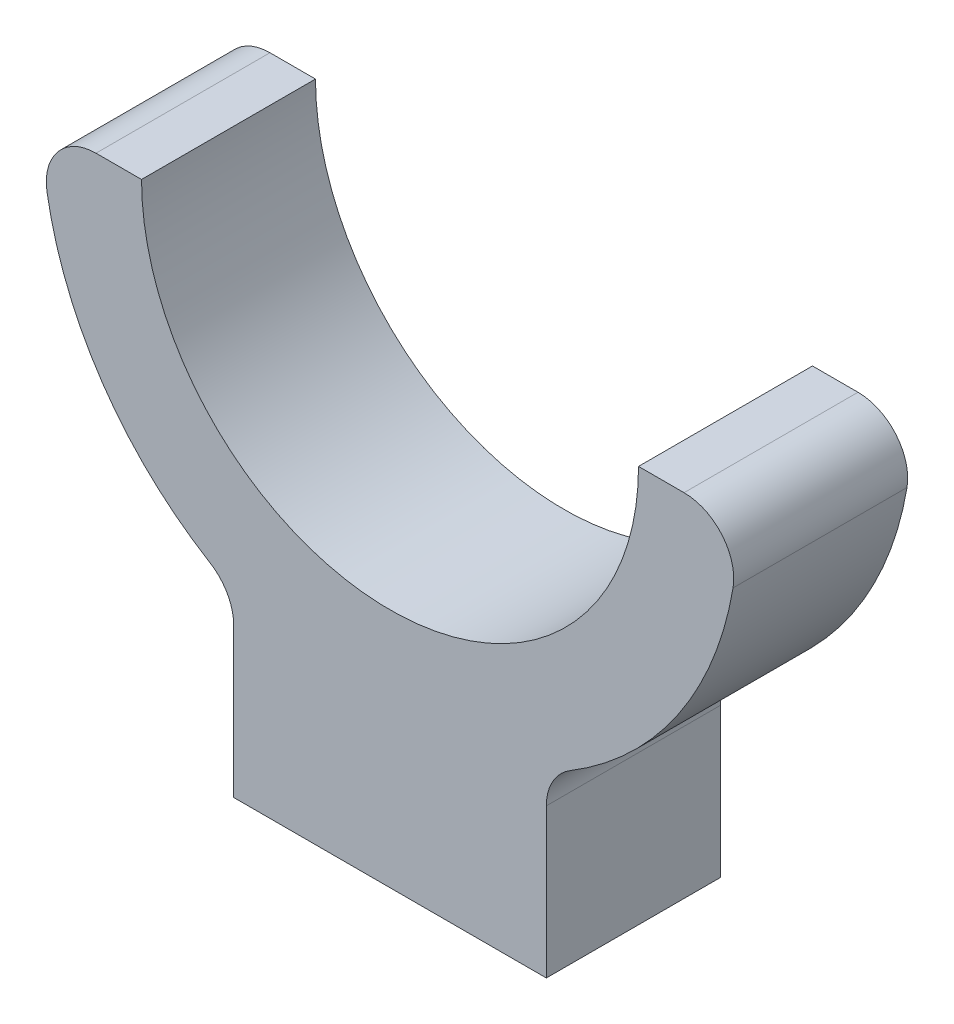
ISO-10303-21;
HEADER;
FILE_DESCRIPTION(('STEP AP214'),'2;1');
FILE_NAME('part.step','',(''),(''),'','','');
FILE_SCHEMA(('AUTOMOTIVE_DESIGN { 1 0 10303 214 1 1 1 1 }'));
ENDSEC;
DATA;
#1=APPLICATION_CONTEXT('core data for automotive mechanical design processes');
#2=APPLICATION_PROTOCOL_DEFINITION('international standard','automotive_design',2000,#1);
#3=PRODUCT_CONTEXT('',#1,'mechanical');
#4=PRODUCT('Part','Part','',(#3));
#5=PRODUCT_RELATED_PRODUCT_CATEGORY('part','',(#4));
#6=PRODUCT_DEFINITION_FORMATION('','',#4);
#7=PRODUCT_DEFINITION_CONTEXT('part definition',#1,'design');
#8=PRODUCT_DEFINITION('design','',#6,#7);
#9=PRODUCT_DEFINITION_SHAPE('','',#8);
#10=(LENGTH_UNIT() NAMED_UNIT(*) SI_UNIT(.MILLI.,.METRE.));
#11=(NAMED_UNIT(*) PLANE_ANGLE_UNIT() SI_UNIT($,.RADIAN.));
#12=(NAMED_UNIT(*) SI_UNIT($,.STERADIAN.) SOLID_ANGLE_UNIT());
#13=UNCERTAINTY_MEASURE_WITH_UNIT(LENGTH_MEASURE(1.E-05),#10,'distance_accuracy_value','');
#14=(GEOMETRIC_REPRESENTATION_CONTEXT(3) GLOBAL_UNCERTAINTY_ASSIGNED_CONTEXT((#13)) GLOBAL_UNIT_ASSIGNED_CONTEXT((#10,
#11,#12)) REPRESENTATION_CONTEXT('',''));
#15=CARTESIAN_POINT('',(0.,0.,0.));
#16=DIRECTION('',(0.,0.,1.));
#17=DIRECTION('',(1.,0.,0.));
#18=AXIS2_PLACEMENT_3D('',#15,#16,#17);
#19=CARTESIAN_POINT('',(-15.026842649073,-2.54,8.89));
#20=DIRECTION('',(0.,0.,-1.));
#21=DIRECTION('',(-1.,0.,0.));
#22=AXIS2_PLACEMENT_3D('',#19,#20,#21);
#23=CYLINDRICAL_SURFACE('',#22,2.54);
#24=CARTESIAN_POINT('',(-15.026842649073,-2.54,0.));
#25=DIRECTION('',(0.,0.,1.));
#26=DIRECTION('',(-1.,0.,0.));
#27=AXIS2_PLACEMENT_3D('',#24,#25,#26);
#28=CIRCLE('',#27,2.54);
#29=CARTESIAN_POINT('',(-15.026842649073,0.,0.));
#30=VERTEX_POINT('',#29);
#31=CARTESIAN_POINT('',(-17.5313164239185,-2.96333333333333,0.));
#32=VERTEX_POINT('',#31);
#33=EDGE_CURVE('E153',#30,#32,#28,.T.);
#34=ORIENTED_EDGE('',*,*,#33,.T.);
#35=DIRECTION('',(0.,0.,-1.));
#36=VECTOR('',#35,1.);
#37=CARTESIAN_POINT('',(-17.5313164239185,-2.96333333333333,8.89));
#38=LINE('',#37,#36);
#39=CARTESIAN_POINT('',(-17.5313164239185,-2.96333333333333,8.89));
#40=VERTEX_POINT('',#39);
#41=EDGE_CURVE('E11',#40,#32,#38,.T.);
#42=ORIENTED_EDGE('',*,*,#41,.F.);
#43=CARTESIAN_POINT('',(-15.026842649073,-2.54,8.89));
#44=DIRECTION('',(0.,0.,1.));
#45=DIRECTION('',(-1.,0.,0.));
#46=AXIS2_PLACEMENT_3D('',#43,#44,#45);
#47=CIRCLE('',#46,2.54);
#48=CARTESIAN_POINT('',(-15.026842649073,0.,8.89));
#49=VERTEX_POINT('',#48);
#50=EDGE_CURVE('E175',#49,#40,#47,.T.);
#51=ORIENTED_EDGE('',*,*,#50,.F.);
#52=DIRECTION('',(0.,0.,-1.));
#53=VECTOR('',#52,1.);
#54=CARTESIAN_POINT('',(-15.026842649073,0.,8.89));
#55=LINE('',#54,#53);
#56=EDGE_CURVE('E149',#49,#30,#55,.T.);
#57=ORIENTED_EDGE('',*,*,#56,.T.);
#58=EDGE_LOOP('',(#34,#42,#51,#57));
#59=FACE_BOUND('',#58,.T.);
#60=ADVANCED_FACE('F33',(#59),#23,.T.);
#61=CARTESIAN_POINT('',(0.,0.,8.89));
#62=DIRECTION('',(0.,0.,-1.));
#63=DIRECTION('',(-1.,0.,0.));
#64=AXIS2_PLACEMENT_3D('',#61,#62,#63);
#65=CYLINDRICAL_SURFACE('',#64,17.78);
#66=CARTESIAN_POINT('',(0.,0.,0.));
#67=DIRECTION('',(0.,0.,1.));
#68=DIRECTION('',(1.,0.,0.));
#69=AXIS2_PLACEMENT_3D('',#66,#67,#68);
#70=CIRCLE('',#69,17.78);
#71=CARTESIAN_POINT('',(-9.21306073920718,-15.206837666513,0.));
#72=VERTEX_POINT('',#71);
#73=EDGE_CURVE('E156',#32,#72,#70,.T.);
#74=ORIENTED_EDGE('',*,*,#73,.T.);
#75=DIRECTION('',(0.,0.,-1.));
#76=VECTOR('',#75,1.);
#77=CARTESIAN_POINT('',(-9.21306073920718,-15.206837666513,8.89));
#78=LINE('',#77,#76);
#79=CARTESIAN_POINT('',(-9.21306073920718,-15.206837666513,8.89));
#80=VERTEX_POINT('',#79);
#81=EDGE_CURVE('E41',#80,#72,#78,.T.);
#82=ORIENTED_EDGE('',*,*,#81,.F.);
#83=CARTESIAN_POINT('',(0.,0.,8.89));
#84=DIRECTION('',(0.,0.,1.));
#85=DIRECTION('',(1.,0.,0.));
#86=AXIS2_PLACEMENT_3D('',#83,#84,#85);
#87=CIRCLE('',#86,17.78);
#88=EDGE_CURVE('E104',#40,#80,#87,.T.);
#89=ORIENTED_EDGE('',*,*,#88,.F.);
#90=ORIENTED_EDGE('',*,*,#41,.T.);
#91=EDGE_LOOP('',(#74,#82,#89,#90));
#92=FACE_BOUND('',#91,.T.);
#93=ADVANCED_FACE('F253',(#92),#65,.T.);
#94=CARTESIAN_POINT('',(-10.5292122733796,-17.3792430474435,8.89));
#95=DIRECTION('',(0.,0.,-1.));
#96=DIRECTION('',(-1.,0.,0.));
#97=AXIS2_PLACEMENT_3D('',#94,#95,#96);
#98=CYLINDRICAL_SURFACE('',#97,2.54);
#99=CARTESIAN_POINT('',(-10.5292122733796,-17.3792430474435,0.));
#100=DIRECTION('',(0.,0.,-1.));
#101=DIRECTION('',(1.,0.,0.));
#102=AXIS2_PLACEMENT_3D('',#99,#100,#101);
#103=CIRCLE('',#102,2.54);
#104=CARTESIAN_POINT('',(-7.98921227337963,-17.3792430474435,0.));
#105=VERTEX_POINT('',#104);
#106=EDGE_CURVE('E158',#72,#105,#103,.T.);
#107=ORIENTED_EDGE('',*,*,#106,.T.);
#108=DIRECTION('',(0.,0.,-1.));
#109=VECTOR('',#108,1.);
#110=CARTESIAN_POINT('',(-7.98921227337963,-17.3792430474435,8.89));
#111=LINE('',#110,#109);
#112=CARTESIAN_POINT('',(-7.98921227337963,-17.3792430474435,8.89));
#113=VERTEX_POINT('',#112);
#114=EDGE_CURVE('E194',#113,#105,#111,.T.);
#115=ORIENTED_EDGE('',*,*,#114,.F.);
#116=CARTESIAN_POINT('',(-10.5292122733796,-17.3792430474435,8.89));
#117=DIRECTION('',(0.,0.,-1.));
#118=DIRECTION('',(1.,0.,0.));
#119=AXIS2_PLACEMENT_3D('',#116,#117,#118);
#120=CIRCLE('',#119,2.54);
#121=EDGE_CURVE('E202',#80,#113,#120,.T.);
#122=ORIENTED_EDGE('',*,*,#121,.F.);
#123=ORIENTED_EDGE('',*,*,#81,.T.);
#124=EDGE_LOOP('',(#107,#115,#122,#123));
#125=FACE_BOUND('',#124,.T.);
#126=ADVANCED_FACE('F200',(#125),#98,.F.);
#127=CARTESIAN_POINT('',(-7.98921227337963,-17.3792430474435,8.89));
#128=DIRECTION('',(1.,0.,0.));
#129=DIRECTION('',(0.,1.,0.));
#130=AXIS2_PLACEMENT_3D('',#127,#128,#129);
#131=PLANE('',#130);
#132=DIRECTION('',(0.,-1.,0.));
#133=VECTOR('',#132,1.);
#134=CARTESIAN_POINT('',(-7.98921227337963,-17.3792430474435,0.));
#135=LINE('',#134,#133);
#136=CARTESIAN_POINT('',(-7.98921227337962,-24.9992430474435,0.));
#137=VERTEX_POINT('',#136);
#138=EDGE_CURVE('E160',#105,#137,#135,.T.);
#139=ORIENTED_EDGE('',*,*,#138,.T.);
#140=DIRECTION('',(0.,0.,-1.));
#141=VECTOR('',#140,1.);
#142=CARTESIAN_POINT('',(-7.98921227337962,-24.9992430474435,8.89));
#143=LINE('',#142,#141);
#144=CARTESIAN_POINT('',(-7.98921227337962,-24.9992430474435,8.89));
#145=VERTEX_POINT('',#144);
#146=EDGE_CURVE('E191',#145,#137,#143,.T.);
#147=ORIENTED_EDGE('',*,*,#146,.F.);
#148=DIRECTION('',(0.,-1.,0.));
#149=VECTOR('',#148,1.);
#150=CARTESIAN_POINT('',(-7.98921227337963,-17.3792430474435,8.89));
#151=LINE('',#150,#149);
#152=EDGE_CURVE('E220',#113,#145,#151,.T.);
#153=ORIENTED_EDGE('',*,*,#152,.F.);
#154=ORIENTED_EDGE('',*,*,#114,.T.);
#155=EDGE_LOOP('',(#139,#147,#153,#154));
#156=FACE_BOUND('',#155,.T.);
#157=ADVANCED_FACE('F211',(#156),#131,.F.);
#158=CARTESIAN_POINT('',(-7.98921227337962,-24.9992430474435,8.89));
#159=DIRECTION('',(0.,1.,0.));
#160=DIRECTION('',(0.,0.,1.));
#161=AXIS2_PLACEMENT_3D('',#158,#159,#160);
#162=PLANE('',#161);
#163=DIRECTION('',(1.,0.,0.));
#164=VECTOR('',#163,1.);
#165=CARTESIAN_POINT('',(-7.98921227337962,-24.9992430474435,0.));
#166=LINE('',#165,#164);
#167=CARTESIAN_POINT('',(7.98921227337962,-24.9992430474435,0.));
#168=VERTEX_POINT('',#167);
#169=EDGE_CURVE('E162',#137,#168,#166,.T.);
#170=ORIENTED_EDGE('',*,*,#169,.T.);
#171=DIRECTION('',(0.,0.,-1.));
#172=VECTOR('',#171,1.);
#173=CARTESIAN_POINT('',(7.98921227337962,-24.9992430474435,8.89));
#174=LINE('',#173,#172);
#175=CARTESIAN_POINT('',(7.98921227337962,-24.9992430474435,8.89));
#176=VERTEX_POINT('',#175);
#177=EDGE_CURVE('E188',#176,#168,#174,.T.);
#178=ORIENTED_EDGE('',*,*,#177,.F.);
#179=DIRECTION('',(1.,0.,0.));
#180=VECTOR('',#179,1.);
#181=CARTESIAN_POINT('',(-7.98921227337962,-24.9992430474435,8.89));
#182=LINE('',#181,#180);
#183=EDGE_CURVE('E217',#145,#176,#182,.T.);
#184=ORIENTED_EDGE('',*,*,#183,.F.);
#185=ORIENTED_EDGE('',*,*,#146,.T.);
#186=EDGE_LOOP('',(#170,#178,#184,#185));
#187=FACE_BOUND('',#186,.T.);
#188=ADVANCED_FACE('F215',(#187),#162,.F.);
#189=CARTESIAN_POINT('',(7.98921227337962,-17.3792430474435,8.89));
#190=DIRECTION('',(-1.,0.,0.));
#191=DIRECTION('',(0.,0.,1.));
#192=AXIS2_PLACEMENT_3D('',#189,#190,#191);
#193=PLANE('',#192);
#194=DIRECTION('',(0.,1.,0.));
#195=VECTOR('',#194,1.);
#196=CARTESIAN_POINT('',(7.98921227337962,-17.3792430474435,0.));
#197=LINE('',#196,#195);
#198=CARTESIAN_POINT('',(7.98921227337962,-17.3792430474435,0.));
#199=VERTEX_POINT('',#198);
#200=EDGE_CURVE('E164',#168,#199,#197,.T.);
#201=ORIENTED_EDGE('',*,*,#200,.T.);
#202=DIRECTION('',(0.,0.,-1.));
#203=VECTOR('',#202,1.);
#204=CARTESIAN_POINT('',(7.98921227337962,-17.3792430474435,8.89));
#205=LINE('',#204,#203);
#206=CARTESIAN_POINT('',(7.98921227337962,-17.3792430474435,8.89));
#207=VERTEX_POINT('',#206);
#208=EDGE_CURVE('E185',#207,#199,#205,.T.);
#209=ORIENTED_EDGE('',*,*,#208,.F.);
#210=DIRECTION('',(0.,1.,0.));
#211=VECTOR('',#210,1.);
#212=CARTESIAN_POINT('',(7.98921227337962,-17.3792430474435,8.89));
#213=LINE('',#212,#211);
#214=EDGE_CURVE('E219',#176,#207,#213,.T.);
#215=ORIENTED_EDGE('',*,*,#214,.F.);
#216=ORIENTED_EDGE('',*,*,#177,.T.);
#217=EDGE_LOOP('',(#201,#209,#215,#216));
#218=FACE_BOUND('',#217,.T.);
#219=ADVANCED_FACE('F266',(#218),#193,.F.);
#220=CARTESIAN_POINT('',(10.5292122733796,-17.3792430474435,8.89));
#221=DIRECTION('',(0.,0.,-1.));
#222=DIRECTION('',(-1.,0.,0.));
#223=AXIS2_PLACEMENT_3D('',#220,#221,#222);
#224=CYLINDRICAL_SURFACE('',#223,2.54);
#225=CARTESIAN_POINT('',(10.5292122733796,-17.3792430474435,0.));
#226=DIRECTION('',(0.,0.,-1.));
#227=DIRECTION('',(-1.,0.,0.));
#228=AXIS2_PLACEMENT_3D('',#225,#226,#227);
#229=CIRCLE('',#228,2.54);
#230=CARTESIAN_POINT('',(9.21306073920717,-15.206837666513,0.));
#231=VERTEX_POINT('',#230);
#232=EDGE_CURVE('E166',#199,#231,#229,.T.);
#233=ORIENTED_EDGE('',*,*,#232,.T.);
#234=DIRECTION('',(0.,0.,-1.));
#235=VECTOR('',#234,1.);
#236=CARTESIAN_POINT('',(9.21306073920717,-15.206837666513,8.89));
#237=LINE('',#236,#235);
#238=CARTESIAN_POINT('',(9.21306073920717,-15.206837666513,8.89));
#239=VERTEX_POINT('',#238);
#240=EDGE_CURVE('E182',#239,#231,#237,.T.);
#241=ORIENTED_EDGE('',*,*,#240,.F.);
#242=CARTESIAN_POINT('',(10.5292122733796,-17.3792430474435,8.89));
#243=DIRECTION('',(0.,0.,-1.));
#244=DIRECTION('',(-1.,0.,0.));
#245=AXIS2_PLACEMENT_3D('',#242,#243,#244);
#246=CIRCLE('',#245,2.54);
#247=EDGE_CURVE('E222',#207,#239,#246,.T.);
#248=ORIENTED_EDGE('',*,*,#247,.F.);
#249=ORIENTED_EDGE('',*,*,#208,.T.);
#250=EDGE_LOOP('',(#233,#241,#248,#249));
#251=FACE_BOUND('',#250,.T.);
#252=ADVANCED_FACE('F269',(#251),#224,.F.);
#253=CARTESIAN_POINT('',(0.,0.,8.89));
#254=DIRECTION('',(0.,0.,-1.));
#255=DIRECTION('',(-1.,0.,0.));
#256=AXIS2_PLACEMENT_3D('',#253,#254,#255);
#257=CYLINDRICAL_SURFACE('',#256,17.78);
#258=CARTESIAN_POINT('',(0.,0.,0.));
#259=DIRECTION('',(0.,0.,1.));
#260=DIRECTION('',(1.,0.,0.));
#261=AXIS2_PLACEMENT_3D('',#258,#259,#260);
#262=CIRCLE('',#261,17.78);
#263=CARTESIAN_POINT('',(17.5313164239185,-2.96333333333334,0.));
#264=VERTEX_POINT('',#263);
#265=EDGE_CURVE('E168',#231,#264,#262,.T.);
#266=ORIENTED_EDGE('',*,*,#265,.T.);
#267=DIRECTION('',(0.,0.,-1.));
#268=VECTOR('',#267,1.);
#269=CARTESIAN_POINT('',(17.5313164239185,-2.96333333333334,8.89));
#270=LINE('',#269,#268);
#271=CARTESIAN_POINT('',(17.5313164239185,-2.96333333333334,8.89));
#272=VERTEX_POINT('',#271);
#273=EDGE_CURVE('E179',#272,#264,#270,.T.);
#274=ORIENTED_EDGE('',*,*,#273,.F.);
#275=CARTESIAN_POINT('',(0.,0.,8.89));
#276=DIRECTION('',(0.,0.,1.));
#277=DIRECTION('',(1.,0.,0.));
#278=AXIS2_PLACEMENT_3D('',#275,#276,#277);
#279=CIRCLE('',#278,17.78);
#280=EDGE_CURVE('E228',#239,#272,#279,.T.);
#281=ORIENTED_EDGE('',*,*,#280,.F.);
#282=ORIENTED_EDGE('',*,*,#240,.T.);
#283=EDGE_LOOP('',(#266,#274,#281,#282));
#284=FACE_BOUND('',#283,.T.);
#285=ADVANCED_FACE('F234',(#284),#257,.T.);
#286=CARTESIAN_POINT('',(15.026842649073,-2.54,8.89));
#287=DIRECTION('',(0.,0.,-1.));
#288=DIRECTION('',(-1.,0.,0.));
#289=AXIS2_PLACEMENT_3D('',#286,#287,#288);
#290=CYLINDRICAL_SURFACE('',#289,2.54);
#291=CARTESIAN_POINT('',(15.026842649073,-2.54,0.));
#292=DIRECTION('',(0.,0.,1.));
#293=DIRECTION('',(1.,0.,0.));
#294=AXIS2_PLACEMENT_3D('',#291,#292,#293);
#295=CIRCLE('',#294,2.54);
#296=CARTESIAN_POINT('',(15.026842649073,0.,0.));
#297=VERTEX_POINT('',#296);
#298=EDGE_CURVE('E170',#264,#297,#295,.T.);
#299=ORIENTED_EDGE('',*,*,#298,.T.);
#300=DIRECTION('',(0.,0.,-1.));
#301=VECTOR('',#300,1.);
#302=CARTESIAN_POINT('',(15.026842649073,0.,8.89));
#303=LINE('',#302,#301);
#304=CARTESIAN_POINT('',(15.026842649073,0.,8.89));
#305=VERTEX_POINT('',#304);
#306=EDGE_CURVE('E144',#305,#297,#303,.T.);
#307=ORIENTED_EDGE('',*,*,#306,.F.);
#308=CARTESIAN_POINT('',(15.026842649073,-2.54,8.89));
#309=DIRECTION('',(0.,0.,1.));
#310=DIRECTION('',(1.,0.,0.));
#311=AXIS2_PLACEMENT_3D('',#308,#309,#310);
#312=CIRCLE('',#311,2.54);
#313=EDGE_CURVE('E135',#272,#305,#312,.T.);
#314=ORIENTED_EDGE('',*,*,#313,.F.);
#315=ORIENTED_EDGE('',*,*,#273,.T.);
#316=EDGE_LOOP('',(#299,#307,#314,#315));
#317=FACE_BOUND('',#316,.T.);
#318=ADVANCED_FACE('F238',(#317),#290,.T.);
#319=CARTESIAN_POINT('',(12.7,0.,8.89));
#320=DIRECTION('',(0.,-1.,0.));
#321=DIRECTION('',(0.,0.,-1.));
#322=AXIS2_PLACEMENT_3D('',#319,#320,#321);
#323=PLANE('',#322);
#324=DIRECTION('',(-1.,0.,0.));
#325=VECTOR('',#324,1.);
#326=CARTESIAN_POINT('',(12.7,0.,0.));
#327=LINE('',#326,#325);
#328=CARTESIAN_POINT('',(12.7,0.,0.));
#329=VERTEX_POINT('',#328);
#330=EDGE_CURVE('E143',#297,#329,#327,.T.);
#331=ORIENTED_EDGE('',*,*,#330,.T.);
#332=DIRECTION('',(0.,0.,-1.));
#333=VECTOR('',#332,1.);
#334=CARTESIAN_POINT('',(12.7,0.,8.89));
#335=LINE('',#334,#333);
#336=CARTESIAN_POINT('',(12.7,0.,8.89));
#337=VERTEX_POINT('',#336);
#338=EDGE_CURVE('E140',#337,#329,#335,.T.);
#339=ORIENTED_EDGE('',*,*,#338,.F.);
#340=DIRECTION('',(-1.,0.,0.));
#341=VECTOR('',#340,1.);
#342=CARTESIAN_POINT('',(12.7,0.,8.89));
#343=LINE('',#342,#341);
#344=EDGE_CURVE('E129',#305,#337,#343,.T.);
#345=ORIENTED_EDGE('',*,*,#344,.F.);
#346=ORIENTED_EDGE('',*,*,#306,.T.);
#347=EDGE_LOOP('',(#331,#339,#345,#346));
#348=FACE_BOUND('',#347,.T.);
#349=ADVANCED_FACE('F141',(#348),#323,.F.);
#350=CARTESIAN_POINT('',(0.,0.,8.89));
#351=DIRECTION('',(0.,0.,-1.));
#352=DIRECTION('',(-1.,0.,0.));
#353=AXIS2_PLACEMENT_3D('',#350,#351,#352);
#354=CYLINDRICAL_SURFACE('',#353,12.7);
#355=CARTESIAN_POINT('',(0.,0.,0.));
#356=DIRECTION('',(0.,0.,-1.));
#357=DIRECTION('',(1.,0.,0.));
#358=AXIS2_PLACEMENT_3D('',#355,#356,#357);
#359=CIRCLE('',#358,12.7);
#360=CARTESIAN_POINT('',(-12.7,0.,0.));
#361=VERTEX_POINT('',#360);
#362=EDGE_CURVE('E90',#329,#361,#359,.T.);
#363=ORIENTED_EDGE('',*,*,#362,.T.);
#364=DIRECTION('',(0.,0.,-1.));
#365=VECTOR('',#364,1.);
#366=CARTESIAN_POINT('',(-12.7,0.,8.89));
#367=LINE('',#366,#365);
#368=CARTESIAN_POINT('',(-12.7,0.,8.89));
#369=VERTEX_POINT('',#368);
#370=EDGE_CURVE('E145',#369,#361,#367,.T.);
#371=ORIENTED_EDGE('',*,*,#370,.F.);
#372=CARTESIAN_POINT('',(0.,0.,8.89));
#373=DIRECTION('',(0.,0.,-1.));
#374=DIRECTION('',(1.,0.,0.));
#375=AXIS2_PLACEMENT_3D('',#372,#373,#374);
#376=CIRCLE('',#375,12.7);
#377=EDGE_CURVE('E133',#337,#369,#376,.T.);
#378=ORIENTED_EDGE('',*,*,#377,.F.);
#379=ORIENTED_EDGE('',*,*,#338,.T.);
#380=EDGE_LOOP('',(#363,#371,#378,#379));
#381=FACE_BOUND('',#380,.T.);
#382=ADVANCED_FACE('F147',(#381),#354,.F.);
#383=CARTESIAN_POINT('',(-15.026842649073,0.,8.89));
#384=DIRECTION('',(0.,-1.,0.));
#385=DIRECTION('',(0.,0.,-1.));
#386=AXIS2_PLACEMENT_3D('',#383,#384,#385);
#387=PLANE('',#386);
#388=DIRECTION('',(-1.,0.,0.));
#389=VECTOR('',#388,1.);
#390=CARTESIAN_POINT('',(-15.026842649073,0.,0.));
#391=LINE('',#390,#389);
#392=EDGE_CURVE('E96',#361,#30,#391,.T.);
#393=ORIENTED_EDGE('',*,*,#392,.T.);
#394=ORIENTED_EDGE('',*,*,#56,.F.);
#395=DIRECTION('',(-1.,0.,0.));
#396=VECTOR('',#395,1.);
#397=CARTESIAN_POINT('',(-15.026842649073,0.,8.89));
#398=LINE('',#397,#396);
#399=EDGE_CURVE('E49',#369,#49,#398,.T.);
#400=ORIENTED_EDGE('',*,*,#399,.F.);
#401=ORIENTED_EDGE('',*,*,#370,.T.);
#402=EDGE_LOOP('',(#393,#394,#400,#401));
#403=FACE_BOUND('',#402,.T.);
#404=ADVANCED_FACE('F242',(#403),#387,.F.);
#405=CARTESIAN_POINT('',(-15.026842649073,-2.54,8.89));
#406=DIRECTION('',(0.,0.,-1.));
#407=DIRECTION('',(-1.,0.,0.));
#408=AXIS2_PLACEMENT_3D('',#405,#406,#407);
#409=PLANE('',#408);
#410=ORIENTED_EDGE('',*,*,#50,.T.);
#411=ORIENTED_EDGE('',*,*,#88,.T.);
#412=ORIENTED_EDGE('',*,*,#121,.T.);
#413=ORIENTED_EDGE('',*,*,#152,.T.);
#414=ORIENTED_EDGE('',*,*,#183,.T.);
#415=ORIENTED_EDGE('',*,*,#214,.T.);
#416=ORIENTED_EDGE('',*,*,#247,.T.);
#417=ORIENTED_EDGE('',*,*,#280,.T.);
#418=ORIENTED_EDGE('',*,*,#313,.T.);
#419=ORIENTED_EDGE('',*,*,#344,.T.);
#420=ORIENTED_EDGE('',*,*,#377,.T.);
#421=ORIENTED_EDGE('',*,*,#399,.T.);
#422=EDGE_LOOP('',(#410,#411,#412,#413,#414,#415,#416,#417,#418,#419,#420,#421));
#423=FACE_BOUND('',#422,.T.);
#424=ADVANCED_FACE('F131',(#423),#409,.F.);
#425=CARTESIAN_POINT('',(-15.026842649073,-2.54,0.));
#426=DIRECTION('',(0.,0.,-1.));
#427=DIRECTION('',(-1.,0.,0.));
#428=AXIS2_PLACEMENT_3D('',#425,#426,#427);
#429=PLANE('',#428);
#430=ORIENTED_EDGE('',*,*,#33,.F.);
#431=ORIENTED_EDGE('',*,*,#392,.F.);
#432=ORIENTED_EDGE('',*,*,#362,.F.);
#433=ORIENTED_EDGE('',*,*,#330,.F.);
#434=ORIENTED_EDGE('',*,*,#298,.F.);
#435=ORIENTED_EDGE('',*,*,#265,.F.);
#436=ORIENTED_EDGE('',*,*,#232,.F.);
#437=ORIENTED_EDGE('',*,*,#200,.F.);
#438=ORIENTED_EDGE('',*,*,#169,.F.);
#439=ORIENTED_EDGE('',*,*,#138,.F.);
#440=ORIENTED_EDGE('',*,*,#106,.F.);
#441=ORIENTED_EDGE('',*,*,#73,.F.);
#442=EDGE_LOOP('',(#430,#431,#432,#433,#434,#435,#436,#437,#438,#439,#440,#441));
#443=FACE_BOUND('',#442,.T.);
#444=ADVANCED_FACE('F206',(#443),#429,.T.);
#445=CLOSED_SHELL('',(#60,#93,#126,#157,#188,#219,#252,#285,#318,#349,#382,#404,#424,#444));
#446=MANIFOLD_SOLID_BREP('B2',#445);
#447=ADVANCED_BREP_SHAPE_REPRESENTATION('',(#18,#446),#14);
#448=SHAPE_DEFINITION_REPRESENTATION(#9,#447);
ENDSEC;
END-ISO-10303-21;
